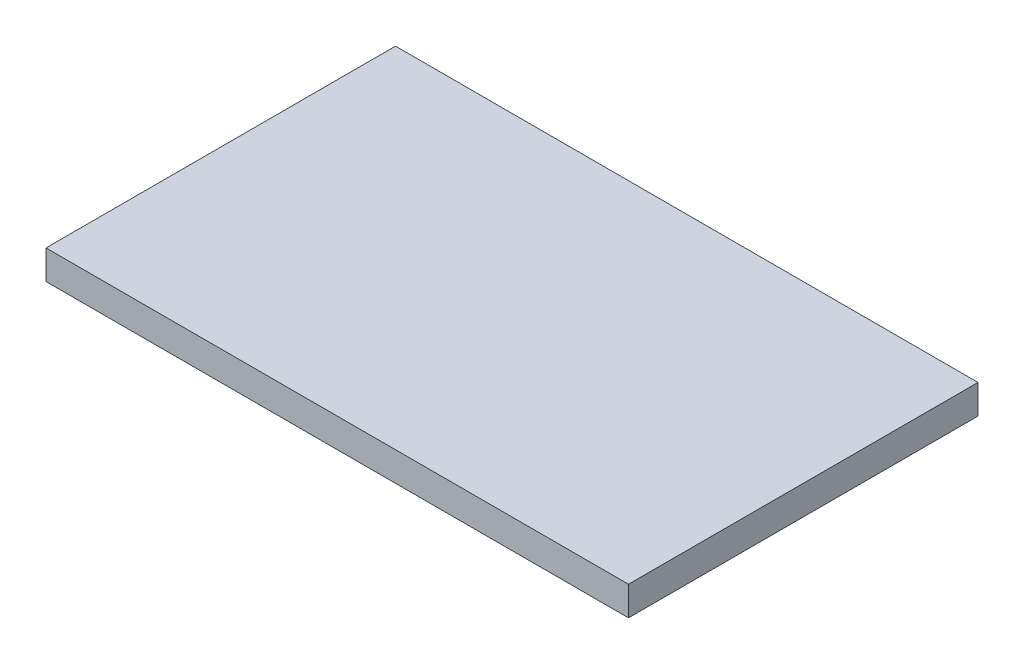
ISO-10303-21;
HEADER;
FILE_DESCRIPTION(('STEP AP214'),'2;1');
FILE_NAME('part.step','',(''),(''),'','','');
FILE_SCHEMA(('AUTOMOTIVE_DESIGN { 1 0 10303 214 1 1 1 1 }'));
ENDSEC;
DATA;
#1=APPLICATION_CONTEXT('core data for automotive mechanical design processes');
#2=APPLICATION_PROTOCOL_DEFINITION('international standard','automotive_design',2000,#1);
#3=PRODUCT_CONTEXT('',#1,'mechanical');
#4=PRODUCT('Part','Part','',(#3));
#5=PRODUCT_RELATED_PRODUCT_CATEGORY('part','',(#4));
#6=PRODUCT_DEFINITION_FORMATION('','',#4);
#7=PRODUCT_DEFINITION_CONTEXT('part definition',#1,'design');
#8=PRODUCT_DEFINITION('design','',#6,#7);
#9=PRODUCT_DEFINITION_SHAPE('','',#8);
#10=(LENGTH_UNIT() NAMED_UNIT(*) SI_UNIT(.MILLI.,.METRE.));
#11=(NAMED_UNIT(*) PLANE_ANGLE_UNIT() SI_UNIT($,.RADIAN.));
#12=(NAMED_UNIT(*) SI_UNIT($,.STERADIAN.) SOLID_ANGLE_UNIT());
#13=UNCERTAINTY_MEASURE_WITH_UNIT(LENGTH_MEASURE(1.E-05),#10,'distance_accuracy_value','');
#14=(GEOMETRIC_REPRESENTATION_CONTEXT(3) GLOBAL_UNCERTAINTY_ASSIGNED_CONTEXT((#13)) GLOBAL_UNIT_ASSIGNED_CONTEXT((#10,
#11,#12)) REPRESENTATION_CONTEXT('',''));
#15=CARTESIAN_POINT('',(0.,0.,0.));
#16=DIRECTION('',(0.,0.,1.));
#17=DIRECTION('',(1.,0.,0.));
#18=AXIS2_PLACEMENT_3D('',#15,#16,#17);
#19=CARTESIAN_POINT('',(0.,10.,0.));
#20=DIRECTION('',(1.,0.,0.));
#21=DIRECTION('',(0.,0.,-1.));
#22=AXIS2_PLACEMENT_3D('',#19,#20,#21);
#23=PLANE('',#22);
#24=DIRECTION('',(0.,0.,1.));
#25=VECTOR('',#24,1.);
#26=CARTESIAN_POINT('',(0.,0.,0.));
#27=LINE('',#26,#25);
#28=CARTESIAN_POINT('',(0.,0.,-120.));
#29=VERTEX_POINT('',#28);
#30=CARTESIAN_POINT('',(0.,0.,0.));
#31=VERTEX_POINT('',#30);
#32=EDGE_CURVE('E95',#29,#31,#27,.T.);
#33=ORIENTED_EDGE('',*,*,#32,.T.);
#34=DIRECTION('',(0.,-1.,0.));
#35=VECTOR('',#34,1.);
#36=CARTESIAN_POINT('',(0.,10.,0.));
#37=LINE('',#36,#35);
#38=CARTESIAN_POINT('',(0.,10.,0.));
#39=VERTEX_POINT('',#38);
#40=EDGE_CURVE('E11',#39,#31,#37,.T.);
#41=ORIENTED_EDGE('',*,*,#40,.F.);
#42=DIRECTION('',(0.,0.,1.));
#43=VECTOR('',#42,1.);
#44=CARTESIAN_POINT('',(0.,10.,0.));
#45=LINE('',#44,#43);
#46=CARTESIAN_POINT('',(0.,10.,-120.));
#47=VERTEX_POINT('',#46);
#48=EDGE_CURVE('E83',#47,#39,#45,.T.);
#49=ORIENTED_EDGE('',*,*,#48,.F.);
#50=DIRECTION('',(0.,-1.,0.));
#51=VECTOR('',#50,1.);
#52=CARTESIAN_POINT('',(0.,10.,-120.));
#53=LINE('',#52,#51);
#54=EDGE_CURVE('E91',#47,#29,#53,.T.);
#55=ORIENTED_EDGE('',*,*,#54,.T.);
#56=EDGE_LOOP('',(#33,#41,#49,#55));
#57=FACE_BOUND('',#56,.T.);
#58=ADVANCED_FACE('F32',(#57),#23,.F.);
#59=CARTESIAN_POINT('',(0.,10.,0.));
#60=DIRECTION('',(0.,0.,-1.));
#61=DIRECTION('',(-1.,0.,0.));
#62=AXIS2_PLACEMENT_3D('',#59,#60,#61);
#63=PLANE('',#62);
#64=DIRECTION('',(1.,0.,0.));
#65=VECTOR('',#64,1.);
#66=CARTESIAN_POINT('',(0.,0.,0.));
#67=LINE('',#66,#65);
#68=CARTESIAN_POINT('',(200.,0.,0.));
#69=VERTEX_POINT('',#68);
#70=EDGE_CURVE('E87',#31,#69,#67,.T.);
#71=ORIENTED_EDGE('',*,*,#70,.T.);
#72=DIRECTION('',(0.,-1.,0.));
#73=VECTOR('',#72,1.);
#74=CARTESIAN_POINT('',(200.,10.,0.));
#75=LINE('',#74,#73);
#76=CARTESIAN_POINT('',(200.,10.,0.));
#77=VERTEX_POINT('',#76);
#78=EDGE_CURVE('E40',#77,#69,#75,.T.);
#79=ORIENTED_EDGE('',*,*,#78,.F.);
#80=DIRECTION('',(1.,0.,0.));
#81=VECTOR('',#80,1.);
#82=CARTESIAN_POINT('',(0.,10.,0.));
#83=LINE('',#82,#81);
#84=EDGE_CURVE('E78',#39,#77,#83,.T.);
#85=ORIENTED_EDGE('',*,*,#84,.F.);
#86=ORIENTED_EDGE('',*,*,#40,.T.);
#87=EDGE_LOOP('',(#71,#79,#85,#86));
#88=FACE_BOUND('',#87,.T.);
#89=ADVANCED_FACE('F86',(#88),#63,.F.);
#90=CARTESIAN_POINT('',(200.,10.,0.));
#91=DIRECTION('',(-1.,0.,0.));
#92=DIRECTION('',(0.,0.,1.));
#93=AXIS2_PLACEMENT_3D('',#90,#91,#92);
#94=PLANE('',#93);
#95=DIRECTION('',(0.,0.,-1.));
#96=VECTOR('',#95,1.);
#97=CARTESIAN_POINT('',(200.,0.,0.));
#98=LINE('',#97,#96);
#99=CARTESIAN_POINT('',(200.,0.,-120.));
#100=VERTEX_POINT('',#99);
#101=EDGE_CURVE('E65',#69,#100,#98,.T.);
#102=ORIENTED_EDGE('',*,*,#101,.T.);
#103=DIRECTION('',(0.,-1.,0.));
#104=VECTOR('',#103,1.);
#105=CARTESIAN_POINT('',(200.,10.,-120.));
#106=LINE('',#105,#104);
#107=CARTESIAN_POINT('',(200.,10.,-120.));
#108=VERTEX_POINT('',#107);
#109=EDGE_CURVE('E88',#108,#100,#106,.T.);
#110=ORIENTED_EDGE('',*,*,#109,.F.);
#111=DIRECTION('',(0.,0.,-1.));
#112=VECTOR('',#111,1.);
#113=CARTESIAN_POINT('',(200.,10.,0.));
#114=LINE('',#113,#112);
#115=EDGE_CURVE('E81',#77,#108,#114,.T.);
#116=ORIENTED_EDGE('',*,*,#115,.F.);
#117=ORIENTED_EDGE('',*,*,#78,.T.);
#118=EDGE_LOOP('',(#102,#110,#116,#117));
#119=FACE_BOUND('',#118,.T.);
#120=ADVANCED_FACE('F89',(#119),#94,.F.);
#121=CARTESIAN_POINT('',(0.,10.,-120.));
#122=DIRECTION('',(0.,0.,1.));
#123=DIRECTION('',(1.,0.,0.));
#124=AXIS2_PLACEMENT_3D('',#121,#122,#123);
#125=PLANE('',#124);
#126=DIRECTION('',(-1.,0.,0.));
#127=VECTOR('',#126,1.);
#128=CARTESIAN_POINT('',(0.,0.,-120.));
#129=LINE('',#128,#127);
#130=EDGE_CURVE('E71',#100,#29,#129,.T.);
#131=ORIENTED_EDGE('',*,*,#130,.T.);
#132=ORIENTED_EDGE('',*,*,#54,.F.);
#133=DIRECTION('',(-1.,0.,0.));
#134=VECTOR('',#133,1.);
#135=CARTESIAN_POINT('',(0.,10.,-120.));
#136=LINE('',#135,#134);
#137=EDGE_CURVE('E48',#108,#47,#136,.T.);
#138=ORIENTED_EDGE('',*,*,#137,.F.);
#139=ORIENTED_EDGE('',*,*,#109,.T.);
#140=EDGE_LOOP('',(#131,#132,#138,#139));
#141=FACE_BOUND('',#140,.T.);
#142=ADVANCED_FACE('F102',(#141),#125,.F.);
#143=CARTESIAN_POINT('',(0.,10.,0.));
#144=DIRECTION('',(0.,-1.,0.));
#145=DIRECTION('',(0.,0.,-1.));
#146=AXIS2_PLACEMENT_3D('',#143,#144,#145);
#147=PLANE('',#146);
#148=ORIENTED_EDGE('',*,*,#48,.T.);
#149=ORIENTED_EDGE('',*,*,#84,.T.);
#150=ORIENTED_EDGE('',*,*,#115,.T.);
#151=ORIENTED_EDGE('',*,*,#137,.T.);
#152=EDGE_LOOP('',(#148,#149,#150,#151));
#153=FACE_BOUND('',#152,.T.);
#154=ADVANCED_FACE('F79',(#153),#147,.F.);
#155=CARTESIAN_POINT('',(0.,0.,0.));
#156=DIRECTION('',(0.,-1.,0.));
#157=DIRECTION('',(0.,0.,-1.));
#158=AXIS2_PLACEMENT_3D('',#155,#156,#157);
#159=PLANE('',#158);
#160=ORIENTED_EDGE('',*,*,#32,.F.);
#161=ORIENTED_EDGE('',*,*,#130,.F.);
#162=ORIENTED_EDGE('',*,*,#101,.F.);
#163=ORIENTED_EDGE('',*,*,#70,.F.);
#164=EDGE_LOOP('',(#160,#161,#162,#163));
#165=FACE_BOUND('',#164,.T.);
#166=ADVANCED_FACE('F105',(#165),#159,.T.);
#167=CLOSED_SHELL('',(#58,#89,#120,#142,#154,#166));
#168=MANIFOLD_SOLID_BREP('B2',#167);
#169=ADVANCED_BREP_SHAPE_REPRESENTATION('',(#18,#168),#14);
#170=SHAPE_DEFINITION_REPRESENTATION(#9,#169);
ENDSEC;
END-ISO-10303-21;
